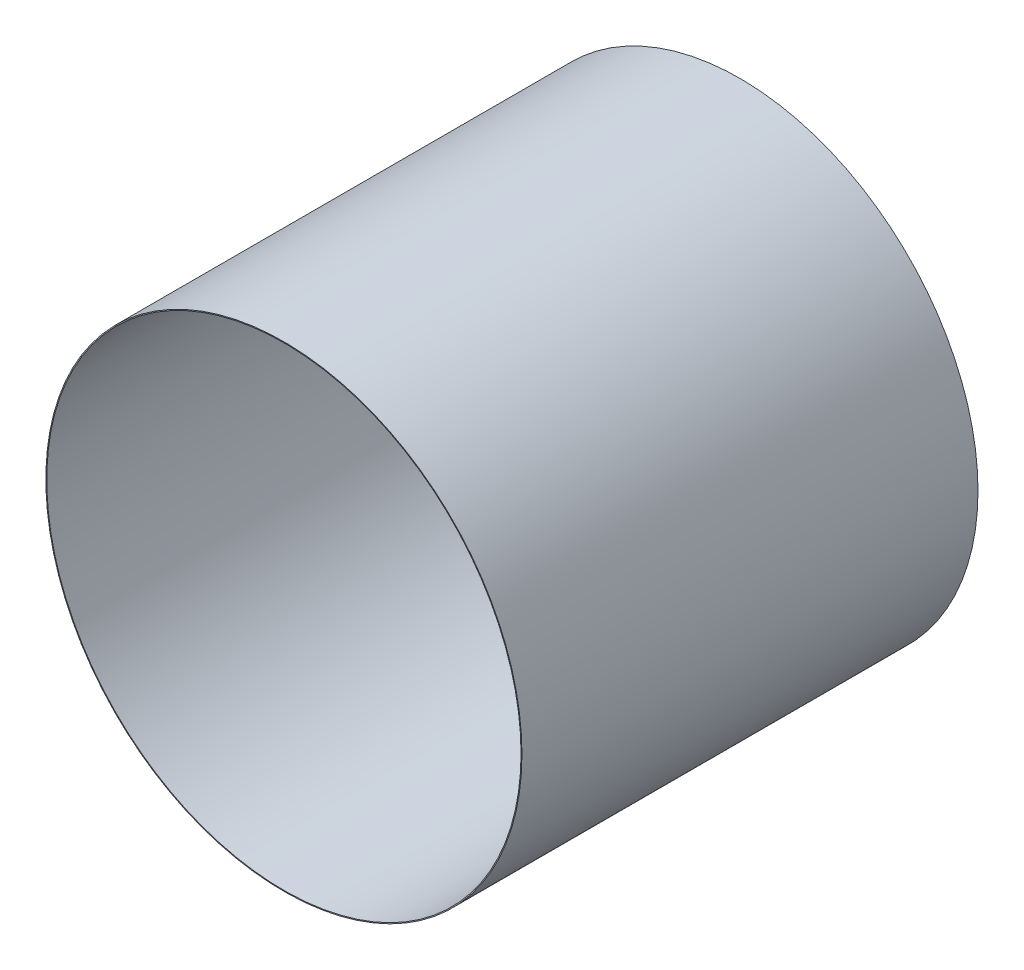
ISO-10303-21;
HEADER;
FILE_DESCRIPTION(('STEP AP214'),'2;1');
FILE_NAME('part.step','',(''),(''),'','','');
FILE_SCHEMA(('AUTOMOTIVE_DESIGN { 1 0 10303 214 1 1 1 1 }'));
ENDSEC;
DATA;
#1=APPLICATION_CONTEXT('core data for automotive mechanical design processes');
#2=APPLICATION_PROTOCOL_DEFINITION('international standard','automotive_design',2000,#1);
#3=PRODUCT_CONTEXT('',#1,'mechanical');
#4=PRODUCT('Part','Part','',(#3));
#5=PRODUCT_RELATED_PRODUCT_CATEGORY('part','',(#4));
#6=PRODUCT_DEFINITION_FORMATION('','',#4);
#7=PRODUCT_DEFINITION_CONTEXT('part definition',#1,'design');
#8=PRODUCT_DEFINITION('design','',#6,#7);
#9=PRODUCT_DEFINITION_SHAPE('','',#8);
#10=(LENGTH_UNIT() NAMED_UNIT(*) SI_UNIT(.MILLI.,.METRE.));
#11=(NAMED_UNIT(*) PLANE_ANGLE_UNIT() SI_UNIT($,.RADIAN.));
#12=(NAMED_UNIT(*) SI_UNIT($,.STERADIAN.) SOLID_ANGLE_UNIT());
#13=UNCERTAINTY_MEASURE_WITH_UNIT(LENGTH_MEASURE(1.E-05),#10,'distance_accuracy_value','');
#14=(GEOMETRIC_REPRESENTATION_CONTEXT(3) GLOBAL_UNCERTAINTY_ASSIGNED_CONTEXT((#13)) GLOBAL_UNIT_ASSIGNED_CONTEXT((#10,
#11,#12)) REPRESENTATION_CONTEXT('',''));
#15=CARTESIAN_POINT('',(0.,0.,0.));
#16=DIRECTION('',(0.,0.,1.));
#17=DIRECTION('',(1.,0.,0.));
#18=AXIS2_PLACEMENT_3D('',#15,#16,#17);
#19=CARTESIAN_POINT('',(0.,0.,25.));
#20=DIRECTION('',(0.,0.,1.));
#21=DIRECTION('',(1.,0.,0.));
#22=AXIS2_PLACEMENT_3D('',#19,#20,#21);
#23=PLANE('',#22);
#24=CARTESIAN_POINT('',(0.,0.,25.));
#25=DIRECTION('',(0.,0.,1.));
#26=DIRECTION('',(1.,0.,0.));
#27=AXIS2_PLACEMENT_3D('',#24,#25,#26);
#28=CIRCLE('',#27,13.05);
#29=CARTESIAN_POINT('',(13.05,0.,25.));
#30=VERTEX_POINT('',#29);
#31=EDGE_CURVE('E10',#30,#30,#28,.T.);
#32=ORIENTED_EDGE('',*,*,#31,.T.);
#33=EDGE_LOOP('',(#32));
#34=FACE_BOUND('',#33,.T.);
#35=CARTESIAN_POINT('',(0.,0.,25.));
#36=DIRECTION('',(0.,0.,1.));
#37=DIRECTION('',(1.,0.,0.));
#38=AXIS2_PLACEMENT_3D('',#35,#36,#37);
#39=CIRCLE('',#38,13.);
#40=CARTESIAN_POINT('',(13.,0.,25.));
#41=VERTEX_POINT('',#40);
#42=EDGE_CURVE('E42',#41,#41,#39,.T.);
#43=ORIENTED_EDGE('',*,*,#42,.F.);
#44=EDGE_LOOP('',(#43));
#45=FACE_BOUND('',#44,.T.);
#46=ADVANCED_FACE('F31',(#34,#45),#23,.T.);
#47=CARTESIAN_POINT('',(0.,0.,0.));
#48=DIRECTION('',(0.,0.,1.));
#49=DIRECTION('',(1.,0.,0.));
#50=AXIS2_PLACEMENT_3D('',#47,#48,#49);
#51=PLANE('',#50);
#52=CARTESIAN_POINT('',(0.,0.,0.));
#53=DIRECTION('',(0.,0.,1.));
#54=DIRECTION('',(1.,0.,0.));
#55=AXIS2_PLACEMENT_3D('',#52,#53,#54);
#56=CIRCLE('',#55,13.05);
#57=CARTESIAN_POINT('',(13.05,0.,0.));
#58=VERTEX_POINT('',#57);
#59=EDGE_CURVE('E35',#58,#58,#56,.T.);
#60=ORIENTED_EDGE('',*,*,#59,.F.);
#61=EDGE_LOOP('',(#60));
#62=FACE_BOUND('',#61,.T.);
#63=CARTESIAN_POINT('',(0.,0.,0.));
#64=DIRECTION('',(0.,0.,1.));
#65=DIRECTION('',(1.,0.,0.));
#66=AXIS2_PLACEMENT_3D('',#63,#64,#65);
#67=CIRCLE('',#66,13.);
#68=CARTESIAN_POINT('',(13.,0.,0.));
#69=VERTEX_POINT('',#68);
#70=EDGE_CURVE('E44',#69,#69,#67,.T.);
#71=ORIENTED_EDGE('',*,*,#70,.T.);
#72=EDGE_LOOP('',(#71));
#73=FACE_BOUND('',#72,.T.);
#74=ADVANCED_FACE('F54',(#62,#73),#51,.F.);
#75=CARTESIAN_POINT('',(0.,0.,25.));
#76=DIRECTION('',(0.,0.,-1.));
#77=DIRECTION('',(-1.,0.,0.));
#78=AXIS2_PLACEMENT_3D('',#75,#76,#77);
#79=CYLINDRICAL_SURFACE('',#78,13.05);
#80=ORIENTED_EDGE('',*,*,#31,.F.);
#81=EDGE_LOOP('',(#80));
#82=FACE_BOUND('',#81,.T.);
#83=ORIENTED_EDGE('',*,*,#59,.T.);
#84=EDGE_LOOP('',(#83));
#85=FACE_BOUND('',#84,.T.);
#86=ADVANCED_FACE('F33',(#82,#85),#79,.T.);
#87=CARTESIAN_POINT('',(0.,0.,25.));
#88=DIRECTION('',(0.,0.,-1.));
#89=DIRECTION('',(-1.,0.,0.));
#90=AXIS2_PLACEMENT_3D('',#87,#88,#89);
#91=CYLINDRICAL_SURFACE('',#90,13.);
#92=ORIENTED_EDGE('',*,*,#42,.T.);
#93=EDGE_LOOP('',(#92));
#94=FACE_BOUND('',#93,.T.);
#95=ORIENTED_EDGE('',*,*,#70,.F.);
#96=EDGE_LOOP('',(#95));
#97=FACE_BOUND('',#96,.T.);
#98=ADVANCED_FACE('F50',(#94,#97),#91,.F.);
#99=CLOSED_SHELL('',(#46,#74,#86,#98));
#100=MANIFOLD_SOLID_BREP('B2',#99);
#101=ADVANCED_BREP_SHAPE_REPRESENTATION('',(#18,#100),#14);
#102=SHAPE_DEFINITION_REPRESENTATION(#9,#101);
ENDSEC;
END-ISO-10303-21;
